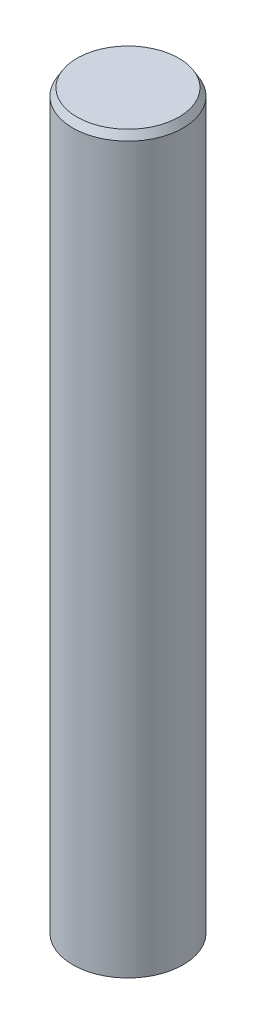
ISO-10303-21;
HEADER;
FILE_DESCRIPTION(('STEP AP214'),'2;1');
FILE_NAME('part.step','',(''),(''),'','','');
FILE_SCHEMA(('AUTOMOTIVE_DESIGN { 1 0 10303 214 1 1 1 1 }'));
ENDSEC;
DATA;
#1=APPLICATION_CONTEXT('core data for automotive mechanical design processes');
#2=APPLICATION_PROTOCOL_DEFINITION('international standard','automotive_design',2000,#1);
#3=PRODUCT_CONTEXT('',#1,'mechanical');
#4=PRODUCT('Part','Part','',(#3));
#5=PRODUCT_RELATED_PRODUCT_CATEGORY('part','',(#4));
#6=PRODUCT_DEFINITION_FORMATION('','',#4);
#7=PRODUCT_DEFINITION_CONTEXT('part definition',#1,'design');
#8=PRODUCT_DEFINITION('design','',#6,#7);
#9=PRODUCT_DEFINITION_SHAPE('','',#8);
#10=(LENGTH_UNIT() NAMED_UNIT(*) SI_UNIT(.MILLI.,.METRE.));
#11=(NAMED_UNIT(*) PLANE_ANGLE_UNIT() SI_UNIT($,.RADIAN.));
#12=(NAMED_UNIT(*) SI_UNIT($,.STERADIAN.) SOLID_ANGLE_UNIT());
#13=UNCERTAINTY_MEASURE_WITH_UNIT(LENGTH_MEASURE(1.E-05),#10,'distance_accuracy_value','');
#14=(GEOMETRIC_REPRESENTATION_CONTEXT(3) GLOBAL_UNCERTAINTY_ASSIGNED_CONTEXT((#13)) GLOBAL_UNIT_ASSIGNED_CONTEXT((#10,
#11,#12)) REPRESENTATION_CONTEXT('',''));
#15=CARTESIAN_POINT('',(0.,0.,0.));
#16=DIRECTION('',(0.,0.,1.));
#17=DIRECTION('',(1.,0.,0.));
#18=AXIS2_PLACEMENT_3D('',#15,#16,#17);
#19=CARTESIAN_POINT('',(0.,20.,0.));
#20=DIRECTION('',(0.,-1.,0.));
#21=DIRECTION('',(0.,0.,-1.));
#22=AXIS2_PLACEMENT_3D('',#19,#20,#21);
#23=CYLINDRICAL_SURFACE('',#22,1.5);
#24=CARTESIAN_POINT('',(0.,0.115470053837927,0.));
#25=DIRECTION('',(0.,1.,0.));
#26=DIRECTION('',(0.,0.,1.));
#27=AXIS2_PLACEMENT_3D('',#24,#25,#26);
#28=CIRCLE('',#27,1.5);
#29=CARTESIAN_POINT('',(0.,0.115470053837927,1.5));
#30=VERTEX_POINT('',#29);
#31=EDGE_CURVE('E53',#30,#30,#28,.T.);
#32=ORIENTED_EDGE('',*,*,#31,.T.);
#33=EDGE_LOOP('',(#32));
#34=FACE_BOUND('',#33,.T.);
#35=CARTESIAN_POINT('',(0.,19.8,0.));
#36=DIRECTION('',(0.,1.,0.));
#37=DIRECTION('',(0.,0.,1.));
#38=AXIS2_PLACEMENT_3D('',#35,#36,#37);
#39=CIRCLE('',#38,1.5);
#40=CARTESIAN_POINT('',(0.,19.8,1.5));
#41=VERTEX_POINT('',#40);
#42=EDGE_CURVE('E57',#41,#41,#39,.F.);
#43=ORIENTED_EDGE('',*,*,#42,.T.);
#44=EDGE_LOOP('',(#43));
#45=FACE_BOUND('',#44,.T.);
#46=ADVANCED_FACE('F41',(#34,#45),#23,.T.);
#47=CARTESIAN_POINT('',(0.,20.,0.));
#48=DIRECTION('',(0.,1.,0.));
#49=DIRECTION('',(0.,0.,1.));
#50=AXIS2_PLACEMENT_3D('',#47,#48,#49);
#51=PLANE('',#50);
#52=CARTESIAN_POINT('',(0.,20.,0.));
#53=DIRECTION('',(0.,1.,0.));
#54=DIRECTION('',(0.,0.,1.));
#55=AXIS2_PLACEMENT_3D('',#52,#53,#54);
#56=CIRCLE('',#55,1.38452994616208);
#57=CARTESIAN_POINT('',(0.,20.,1.38452994616208));
#58=VERTEX_POINT('',#57);
#59=EDGE_CURVE('E10',#58,#58,#56,.T.);
#60=ORIENTED_EDGE('',*,*,#59,.T.);
#61=EDGE_LOOP('',(#60));
#62=FACE_BOUND('',#61,.T.);
#63=ADVANCED_FACE('F73',(#62),#51,.T.);
#64=CARTESIAN_POINT('',(0.,0.,0.));
#65=DIRECTION('',(0.,1.,0.));
#66=DIRECTION('',(0.,0.,1.));
#67=AXIS2_PLACEMENT_3D('',#64,#65,#66);
#68=PLANE('',#67);
#69=CARTESIAN_POINT('',(0.,0.,0.));
#70=DIRECTION('',(0.,1.,0.));
#71=DIRECTION('',(0.,0.,1.));
#72=AXIS2_PLACEMENT_3D('',#69,#70,#71);
#73=CIRCLE('',#72,1.3);
#74=CARTESIAN_POINT('',(0.,0.,1.3));
#75=VERTEX_POINT('',#74);
#76=EDGE_CURVE('E49',#75,#75,#73,.F.);
#77=ORIENTED_EDGE('',*,*,#76,.T.);
#78=EDGE_LOOP('',(#77));
#79=FACE_BOUND('',#78,.T.);
#80=ADVANCED_FACE('F70',(#79),#68,.F.);
#81=CARTESIAN_POINT('',(0.,0.115470053837927,0.));
#82=DIRECTION('',(0.,1.,0.));
#83=DIRECTION('',(0.,0.,1.));
#84=AXIS2_PLACEMENT_3D('',#81,#82,#83);
#85=CONICAL_SURFACE('',#84,1.5,1.04719755119659);
#86=ORIENTED_EDGE('',*,*,#76,.F.);
#87=EDGE_LOOP('',(#86));
#88=FACE_BOUND('',#87,.T.);
#89=ORIENTED_EDGE('',*,*,#31,.F.);
#90=EDGE_LOOP('',(#89));
#91=FACE_BOUND('',#90,.T.);
#92=ADVANCED_FACE('F66',(#88,#91),#85,.T.);
#93=CARTESIAN_POINT('',(0.,20.,0.));
#94=DIRECTION('',(0.,-1.,0.));
#95=DIRECTION('',(0.,0.,-1.));
#96=AXIS2_PLACEMENT_3D('',#93,#94,#95);
#97=CONICAL_SURFACE('',#96,1.38452994616208,0.523598775598297);
#98=ORIENTED_EDGE('',*,*,#42,.F.);
#99=EDGE_LOOP('',(#98));
#100=FACE_BOUND('',#99,.T.);
#101=ORIENTED_EDGE('',*,*,#59,.F.);
#102=EDGE_LOOP('',(#101));
#103=FACE_BOUND('',#102,.T.);
#104=ADVANCED_FACE('F44',(#100,#103),#97,.T.);
#105=CLOSED_SHELL('',(#46,#63,#80,#92,#104));
#106=MANIFOLD_SOLID_BREP('B2',#105);
#107=ADVANCED_BREP_SHAPE_REPRESENTATION('',(#18,#106),#14);
#108=SHAPE_DEFINITION_REPRESENTATION(#9,#107);
ENDSEC;
END-ISO-10303-21;
